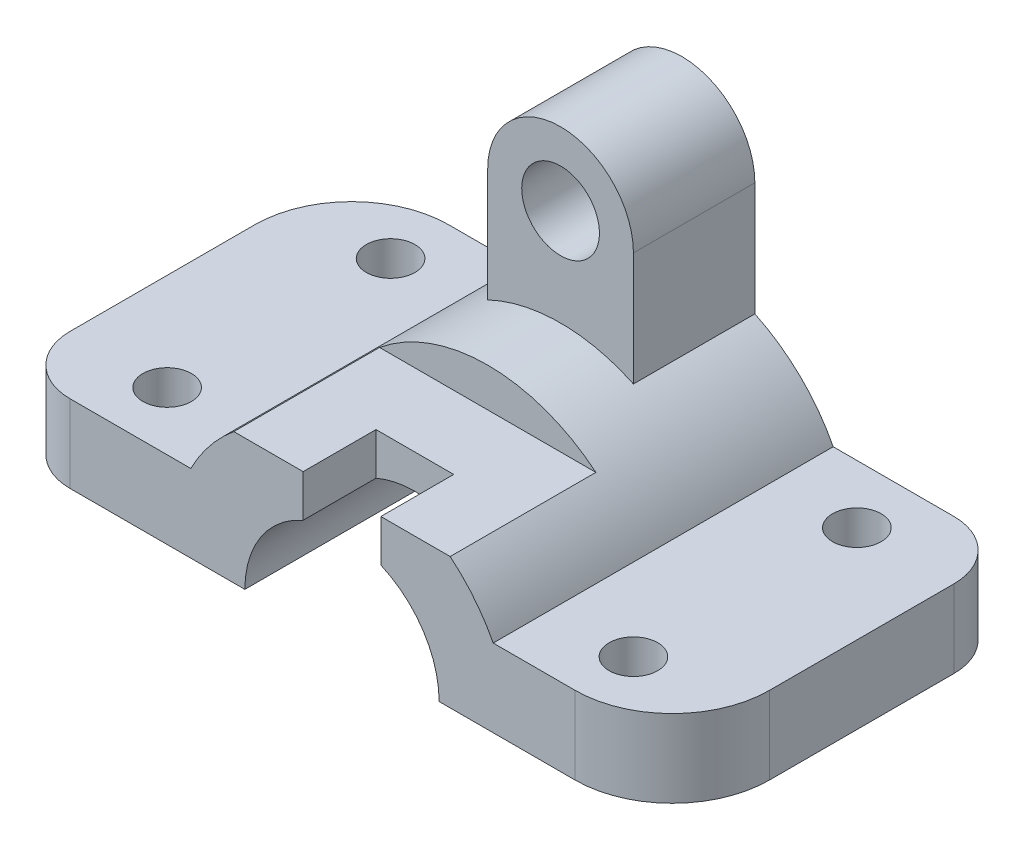
ISO-10303-21;
HEADER;
FILE_DESCRIPTION(('STEP AP214'),'2;1');
FILE_NAME('part.step','',(''),(''),'','','');
FILE_SCHEMA(('AUTOMOTIVE_DESIGN { 1 0 10303 214 1 1 1 1 }'));
ENDSEC;
DATA;
#1=APPLICATION_CONTEXT('core data for automotive mechanical design processes');
#2=APPLICATION_PROTOCOL_DEFINITION('international standard','automotive_design',2000,#1);
#3=PRODUCT_CONTEXT('',#1,'mechanical');
#4=PRODUCT('Part','Part','',(#3));
#5=PRODUCT_RELATED_PRODUCT_CATEGORY('part','',(#4));
#6=PRODUCT_DEFINITION_FORMATION('','',#4);
#7=PRODUCT_DEFINITION_CONTEXT('part definition',#1,'design');
#8=PRODUCT_DEFINITION('design','',#6,#7);
#9=PRODUCT_DEFINITION_SHAPE('','',#8);
#10=(LENGTH_UNIT() NAMED_UNIT(*) SI_UNIT(.MILLI.,.METRE.));
#11=(NAMED_UNIT(*) PLANE_ANGLE_UNIT() SI_UNIT($,.RADIAN.));
#12=(NAMED_UNIT(*) SI_UNIT($,.STERADIAN.) SOLID_ANGLE_UNIT());
#13=UNCERTAINTY_MEASURE_WITH_UNIT(LENGTH_MEASURE(1.E-05),#10,'distance_accuracy_value','');
#14=(GEOMETRIC_REPRESENTATION_CONTEXT(3) GLOBAL_UNCERTAINTY_ASSIGNED_CONTEXT((#13)) GLOBAL_UNIT_ASSIGNED_CONTEXT((#10,
#11,#12)) REPRESENTATION_CONTEXT('',''));
#15=CARTESIAN_POINT('',(0.,0.,0.));
#16=DIRECTION('',(0.,0.,1.));
#17=DIRECTION('',(1.,0.,0.));
#18=AXIS2_PLACEMENT_3D('',#15,#16,#17);
#19=CARTESIAN_POINT('',(0.,0.,0.));
#20=DIRECTION('',(0.,0.,1.));
#21=DIRECTION('',(1.,0.,0.));
#22=AXIS2_PLACEMENT_3D('',#19,#20,#21);
#23=PLANE('',#22);
#24=DIRECTION('',(-1.,0.,0.));
#25=VECTOR('',#24,1.);
#26=CARTESIAN_POINT('',(0.,16.,0.));
#27=LINE('',#26,#25);
#28=CARTESIAN_POINT('',(-31.1287648325468,16.,0.));
#29=VERTEX_POINT('',#28);
#30=CARTESIAN_POINT('',(-56.,16.,0.));
#31=VERTEX_POINT('',#30);
#32=EDGE_CURVE('E341',#29,#31,#27,.T.);
#33=ORIENTED_EDGE('',*,*,#32,.T.);
#34=DIRECTION('',(0.,1.,0.));
#35=VECTOR('',#34,1.);
#36=CARTESIAN_POINT('',(-56.,0.,0.));
#37=LINE('',#36,#35);
#38=CARTESIAN_POINT('',(-56.,0.,0.));
#39=VERTEX_POINT('',#38);
#40=EDGE_CURVE('E56',#31,#39,#37,.F.);
#41=ORIENTED_EDGE('',*,*,#40,.T.);
#42=DIRECTION('',(-1.,0.,0.));
#43=VECTOR('',#42,1.);
#44=CARTESIAN_POINT('',(0.,0.,0.));
#45=LINE('',#44,#43);
#46=CARTESIAN_POINT('',(-20.,0.,0.));
#47=VERTEX_POINT('',#46);
#48=EDGE_CURVE('E344',#47,#39,#45,.T.);
#49=ORIENTED_EDGE('',*,*,#48,.F.);
#50=CARTESIAN_POINT('',(0.,0.,0.));
#51=DIRECTION('',(0.,0.,1.));
#52=DIRECTION('',(1.,0.,0.));
#53=AXIS2_PLACEMENT_3D('',#50,#51,#52);
#54=CIRCLE('',#53,20.);
#55=CARTESIAN_POINT('',(-8.,18.3303027798234,0.));
#56=VERTEX_POINT('',#55);
#57=EDGE_CURVE('E348',#47,#56,#54,.F.);
#58=ORIENTED_EDGE('',*,*,#57,.T.);
#59=DIRECTION('',(0.,1.,0.));
#60=VECTOR('',#59,1.);
#61=CARTESIAN_POINT('',(-8.,0.,0.));
#62=LINE('',#61,#60);
#63=CARTESIAN_POINT('',(-8.,27.,0.));
#64=VERTEX_POINT('',#63);
#65=EDGE_CURVE('E264',#56,#64,#62,.T.);
#66=ORIENTED_EDGE('',*,*,#65,.T.);
#67=DIRECTION('',(1.,0.,0.));
#68=VECTOR('',#67,1.);
#69=CARTESIAN_POINT('',(0.,27.,0.));
#70=LINE('',#69,#68);
#71=CARTESIAN_POINT('',(-22.2710574513201,27.,0.));
#72=VERTEX_POINT('',#71);
#73=EDGE_CURVE('E292',#72,#64,#70,.T.);
#74=ORIENTED_EDGE('',*,*,#73,.F.);
#75=CARTESIAN_POINT('',(0.,0.,0.));
#76=DIRECTION('',(0.,0.,1.));
#77=DIRECTION('',(1.,0.,0.));
#78=AXIS2_PLACEMENT_3D('',#75,#76,#77);
#79=CIRCLE('',#78,35.);
#80=EDGE_CURVE('E337',#29,#72,#79,.F.);
#81=ORIENTED_EDGE('',*,*,#80,.F.);
#82=EDGE_LOOP('',(#33,#41,#49,#58,#66,#74,#81));
#83=FACE_BOUND('',#82,.T.);
#84=ADVANCED_FACE('F47',(#83),#23,.T.);
#85=CARTESIAN_POINT('',(0.,16.,-70.));
#86=DIRECTION('',(0.,-1.,0.));
#87=DIRECTION('',(1.,0.,0.));
#88=AXIS2_PLACEMENT_3D('',#85,#86,#87);
#89=PLANE('',#88);
#90=CARTESIAN_POINT('',(48.,16.,-12.));
#91=DIRECTION('',(0.,1.,0.));
#92=DIRECTION('',(1.,0.,0.));
#93=AXIS2_PLACEMENT_3D('',#90,#91,#92);
#94=CIRCLE('',#93,5.00000000000001);
#95=CARTESIAN_POINT('',(53.,16.,-12.));
#96=VERTEX_POINT('',#95);
#97=EDGE_CURVE('E573',#96,#96,#94,.T.);
#98=ORIENTED_EDGE('',*,*,#97,.F.);
#99=EDGE_LOOP('',(#98));
#100=FACE_BOUND('',#99,.T.);
#101=CARTESIAN_POINT('',(48.,16.,-58.));
#102=DIRECTION('',(0.,1.,0.));
#103=DIRECTION('',(-1.,0.,0.));
#104=AXIS2_PLACEMENT_3D('',#101,#102,#103);
#105=CIRCLE('',#104,5.);
#106=CARTESIAN_POINT('',(43.,16.,-58.));
#107=VERTEX_POINT('',#106);
#108=EDGE_CURVE('E563',#107,#107,#105,.T.);
#109=ORIENTED_EDGE('',*,*,#108,.F.);
#110=EDGE_LOOP('',(#109));
#111=FACE_BOUND('',#110,.T.);
#112=DIRECTION('',(0.,0.,1.));
#113=VECTOR('',#112,1.);
#114=CARTESIAN_POINT('',(68.,16.,-70.));
#115=LINE('',#114,#113);
#116=CARTESIAN_POINT('',(68.,16.,-58.));
#117=VERTEX_POINT('',#116);
#118=CARTESIAN_POINT('',(68.,16.,-20.));
#119=VERTEX_POINT('',#118);
#120=EDGE_CURVE('E355',#117,#119,#115,.T.);
#121=ORIENTED_EDGE('',*,*,#120,.F.);
#122=CARTESIAN_POINT('',(56.,16.,-58.));
#123=DIRECTION('',(0.,-1.,0.));
#124=DIRECTION('',(1.,0.,0.));
#125=AXIS2_PLACEMENT_3D('',#122,#123,#124);
#126=CIRCLE('',#125,12.);
#127=CARTESIAN_POINT('',(56.,16.,-70.));
#128=VERTEX_POINT('',#127);
#129=EDGE_CURVE('E413',#117,#128,#126,.F.);
#130=ORIENTED_EDGE('',*,*,#129,.T.);
#131=DIRECTION('',(1.,0.,0.));
#132=VECTOR('',#131,1.);
#133=CARTESIAN_POINT('',(0.,16.,-70.));
#134=LINE('',#133,#132);
#135=CARTESIAN_POINT('',(31.1287648325468,16.,-70.));
#136=VERTEX_POINT('',#135);
#137=EDGE_CURVE('E307',#136,#128,#134,.T.);
#138=ORIENTED_EDGE('',*,*,#137,.F.);
#139=DIRECTION('',(0.,0.,1.));
#140=VECTOR('',#139,1.);
#141=CARTESIAN_POINT('',(31.1287648325468,16.,-70.));
#142=LINE('',#141,#140);
#143=CARTESIAN_POINT('',(31.1287648325468,16.,0.));
#144=VERTEX_POINT('',#143);
#145=EDGE_CURVE('E332',#136,#144,#142,.T.);
#146=ORIENTED_EDGE('',*,*,#145,.T.);
#147=DIRECTION('',(1.,0.,0.));
#148=VECTOR('',#147,1.);
#149=CARTESIAN_POINT('',(0.,16.,0.));
#150=LINE('',#149,#148);
#151=CARTESIAN_POINT('',(48.,16.,0.));
#152=VERTEX_POINT('',#151);
#153=EDGE_CURVE('E303',#144,#152,#150,.T.);
#154=ORIENTED_EDGE('',*,*,#153,.T.);
#155=CARTESIAN_POINT('',(48.,16.,-20.));
#156=DIRECTION('',(0.,-1.,0.));
#157=DIRECTION('',(1.,0.,0.));
#158=AXIS2_PLACEMENT_3D('',#155,#156,#157);
#159=CIRCLE('',#158,20.);
#160=EDGE_CURVE('E398',#152,#119,#159,.F.);
#161=ORIENTED_EDGE('',*,*,#160,.T.);
#162=EDGE_LOOP('',(#121,#130,#138,#146,#154,#161));
#163=FACE_BOUND('',#162,.T.);
#164=ADVANCED_FACE('F448',(#100,#111,#163),#89,.F.);
#165=CARTESIAN_POINT('',(68.,0.,-70.));
#166=DIRECTION('',(1.,0.,0.));
#167=DIRECTION('',(0.,0.,-1.));
#168=AXIS2_PLACEMENT_3D('',#165,#166,#167);
#169=PLANE('',#168);
#170=DIRECTION('',(0.,0.,1.));
#171=VECTOR('',#170,1.);
#172=CARTESIAN_POINT('',(68.,0.,-70.));
#173=LINE('',#172,#171);
#174=CARTESIAN_POINT('',(68.,0.,-58.));
#175=VERTEX_POINT('',#174);
#176=CARTESIAN_POINT('',(68.,0.,-20.));
#177=VERTEX_POINT('',#176);
#178=EDGE_CURVE('E359',#175,#177,#173,.T.);
#179=ORIENTED_EDGE('',*,*,#178,.F.);
#180=DIRECTION('',(0.,1.,0.));
#181=VECTOR('',#180,1.);
#182=CARTESIAN_POINT('',(68.,16.,-58.));
#183=LINE('',#182,#181);
#184=EDGE_CURVE('E409',#175,#117,#183,.T.);
#185=ORIENTED_EDGE('',*,*,#184,.T.);
#186=ORIENTED_EDGE('',*,*,#120,.T.);
#187=DIRECTION('',(0.,1.,0.));
#188=VECTOR('',#187,1.);
#189=CARTESIAN_POINT('',(68.,0.,-20.));
#190=LINE('',#189,#188);
#191=EDGE_CURVE('E402',#119,#177,#190,.F.);
#192=ORIENTED_EDGE('',*,*,#191,.T.);
#193=EDGE_LOOP('',(#179,#185,#186,#192));
#194=FACE_BOUND('',#193,.T.);
#195=ADVANCED_FACE('F487',(#194),#169,.T.);
#196=CARTESIAN_POINT('',(0.,0.,-70.));
#197=DIRECTION('',(0.,-1.,0.));
#198=DIRECTION('',(1.,0.,0.));
#199=AXIS2_PLACEMENT_3D('',#196,#197,#198);
#200=PLANE('',#199);
#201=CARTESIAN_POINT('',(48.,0.,-12.));
#202=DIRECTION('',(0.,1.,0.));
#203=DIRECTION('',(1.,0.,0.));
#204=AXIS2_PLACEMENT_3D('',#201,#202,#203);
#205=CIRCLE('',#204,5.00000000000001);
#206=CARTESIAN_POINT('',(53.,0.,-12.));
#207=VERTEX_POINT('',#206);
#208=EDGE_CURVE('E577',#207,#207,#205,.T.);
#209=ORIENTED_EDGE('',*,*,#208,.T.);
#210=EDGE_LOOP('',(#209));
#211=FACE_BOUND('',#210,.T.);
#212=CARTESIAN_POINT('',(48.,0.,-58.));
#213=DIRECTION('',(0.,1.,0.));
#214=DIRECTION('',(-1.,0.,0.));
#215=AXIS2_PLACEMENT_3D('',#212,#213,#214);
#216=CIRCLE('',#215,5.);
#217=CARTESIAN_POINT('',(43.,0.,-58.));
#218=VERTEX_POINT('',#217);
#219=EDGE_CURVE('E569',#218,#218,#216,.T.);
#220=ORIENTED_EDGE('',*,*,#219,.T.);
#221=EDGE_LOOP('',(#220));
#222=FACE_BOUND('',#221,.T.);
#223=DIRECTION('',(1.,0.,0.));
#224=VECTOR('',#223,1.);
#225=CARTESIAN_POINT('',(0.,0.,-70.));
#226=LINE('',#225,#224);
#227=CARTESIAN_POINT('',(20.,0.,-70.));
#228=VERTEX_POINT('',#227);
#229=CARTESIAN_POINT('',(56.,0.,-70.));
#230=VERTEX_POINT('',#229);
#231=EDGE_CURVE('E328',#228,#230,#226,.T.);
#232=ORIENTED_EDGE('',*,*,#231,.T.);
#233=CARTESIAN_POINT('',(56.,0.,-58.));
#234=DIRECTION('',(0.,-1.,0.));
#235=DIRECTION('',(1.,0.,0.));
#236=AXIS2_PLACEMENT_3D('',#233,#234,#235);
#237=CIRCLE('',#236,12.);
#238=EDGE_CURVE('E419',#230,#175,#237,.T.);
#239=ORIENTED_EDGE('',*,*,#238,.T.);
#240=ORIENTED_EDGE('',*,*,#178,.T.);
#241=CARTESIAN_POINT('',(48.,0.,-20.));
#242=DIRECTION('',(0.,-1.,0.));
#243=DIRECTION('',(1.,0.,0.));
#244=AXIS2_PLACEMENT_3D('',#241,#242,#243);
#245=CIRCLE('',#244,20.);
#246=CARTESIAN_POINT('',(48.,0.,0.));
#247=VERTEX_POINT('',#246);
#248=EDGE_CURVE('E406',#177,#247,#245,.T.);
#249=ORIENTED_EDGE('',*,*,#248,.T.);
#250=DIRECTION('',(1.,0.,0.));
#251=VECTOR('',#250,1.);
#252=CARTESIAN_POINT('',(0.,0.,0.));
#253=LINE('',#252,#251);
#254=CARTESIAN_POINT('',(20.,0.,0.));
#255=VERTEX_POINT('',#254);
#256=EDGE_CURVE('E312',#255,#247,#253,.T.);
#257=ORIENTED_EDGE('',*,*,#256,.F.);
#258=DIRECTION('',(0.,0.,1.));
#259=VECTOR('',#258,1.);
#260=CARTESIAN_POINT('',(20.,0.,-70.));
#261=LINE('',#260,#259);
#262=EDGE_CURVE('E362',#228,#255,#261,.T.);
#263=ORIENTED_EDGE('',*,*,#262,.F.);
#264=EDGE_LOOP('',(#232,#239,#240,#249,#257,#263));
#265=FACE_BOUND('',#264,.T.);
#266=ADVANCED_FACE('F630',(#211,#222,#265),#200,.T.);
#267=CARTESIAN_POINT('',(0.,0.,-70.));
#268=DIRECTION('',(0.,0.,1.));
#269=DIRECTION('',(1.,0.,0.));
#270=AXIS2_PLACEMENT_3D('',#267,#268,#269);
#271=CYLINDRICAL_SURFACE('',#270,20.);
#272=DIRECTION('',(0.,0.,1.));
#273=VECTOR('',#272,1.);
#274=CARTESIAN_POINT('',(-8.,18.3303027798234,-70.));
#275=LINE('',#274,#273);
#276=CARTESIAN_POINT('',(-8.,18.3303027798234,-15.));
#277=VERTEX_POINT('',#276);
#278=EDGE_CURVE('E283',#56,#277,#275,.F.);
#279=ORIENTED_EDGE('',*,*,#278,.F.);
#280=ORIENTED_EDGE('',*,*,#57,.F.);
#281=DIRECTION('',(0.,0.,1.));
#282=VECTOR('',#281,1.);
#283=CARTESIAN_POINT('',(-20.,0.,-70.));
#284=LINE('',#283,#282);
#285=CARTESIAN_POINT('',(-20.,0.,-70.));
#286=VERTEX_POINT('',#285);
#287=EDGE_CURVE('E366',#286,#47,#284,.T.);
#288=ORIENTED_EDGE('',*,*,#287,.F.);
#289=CARTESIAN_POINT('',(0.,0.,-70.));
#290=DIRECTION('',(0.,0.,1.));
#291=DIRECTION('',(1.,0.,0.));
#292=AXIS2_PLACEMENT_3D('',#289,#290,#291);
#293=CIRCLE('',#292,20.);
#294=EDGE_CURVE('E324',#286,#228,#293,.F.);
#295=ORIENTED_EDGE('',*,*,#294,.T.);
#296=ORIENTED_EDGE('',*,*,#262,.T.);
#297=CARTESIAN_POINT('',(8.,18.3303027798234,0.));
#298=VERTEX_POINT('',#297);
#299=EDGE_CURVE('E347',#298,#255,#54,.F.);
#300=ORIENTED_EDGE('',*,*,#299,.F.);
#301=DIRECTION('',(0.,0.,1.));
#302=VECTOR('',#301,1.);
#303=CARTESIAN_POINT('',(8.,18.3303027798234,-70.));
#304=LINE('',#303,#302);
#305=CARTESIAN_POINT('',(8.,18.3303027798234,-15.));
#306=VERTEX_POINT('',#305);
#307=EDGE_CURVE('E268',#306,#298,#304,.T.);
#308=ORIENTED_EDGE('',*,*,#307,.F.);
#309=CARTESIAN_POINT('',(0.,0.,-15.));
#310=DIRECTION('',(0.,0.,-1.));
#311=DIRECTION('',(-1.,0.,0.));
#312=AXIS2_PLACEMENT_3D('',#309,#310,#311);
#313=CIRCLE('',#312,20.);
#314=EDGE_CURVE('E280',#277,#306,#313,.T.);
#315=ORIENTED_EDGE('',*,*,#314,.F.);
#316=EDGE_LOOP('',(#279,#280,#288,#295,#296,#300,#308,#315));
#317=FACE_BOUND('',#316,.T.);
#318=ADVANCED_FACE('F596',(#317),#271,.F.);
#319=CARTESIAN_POINT('',(0.,0.,-70.));
#320=DIRECTION('',(0.,1.,0.));
#321=DIRECTION('',(-1.,0.,0.));
#322=AXIS2_PLACEMENT_3D('',#319,#320,#321);
#323=PLANE('',#322);
#324=CARTESIAN_POINT('',(-48.,0.,-58.));
#325=DIRECTION('',(0.,1.,0.));
#326=DIRECTION('',(1.,0.,0.));
#327=AXIS2_PLACEMENT_3D('',#324,#325,#326);
#328=CIRCLE('',#327,5.);
#329=CARTESIAN_POINT('',(-43.,0.,-58.));
#330=VERTEX_POINT('',#329);
#331=EDGE_CURVE('E552',#330,#330,#328,.T.);
#332=ORIENTED_EDGE('',*,*,#331,.T.);
#333=EDGE_LOOP('',(#332));
#334=FACE_BOUND('',#333,.T.);
#335=CARTESIAN_POINT('',(-48.,0.,-12.));
#336=DIRECTION('',(0.,1.,0.));
#337=DIRECTION('',(-1.,0.,0.));
#338=AXIS2_PLACEMENT_3D('',#335,#336,#337);
#339=CIRCLE('',#338,5.);
#340=CARTESIAN_POINT('',(-53.,0.,-12.));
#341=VERTEX_POINT('',#340);
#342=EDGE_CURVE('E561',#341,#341,#339,.T.);
#343=ORIENTED_EDGE('',*,*,#342,.T.);
#344=EDGE_LOOP('',(#343));
#345=FACE_BOUND('',#344,.T.);
#346=ORIENTED_EDGE('',*,*,#48,.T.);
#347=CARTESIAN_POINT('',(-56.,0.,-12.));
#348=DIRECTION('',(0.,1.,0.));
#349=DIRECTION('',(-1.,0.,0.));
#350=AXIS2_PLACEMENT_3D('',#347,#348,#349);
#351=CIRCLE('',#350,12.);
#352=CARTESIAN_POINT('',(-68.,0.,-12.));
#353=VERTEX_POINT('',#352);
#354=EDGE_CURVE('E11',#39,#353,#351,.F.);
#355=ORIENTED_EDGE('',*,*,#354,.T.);
#356=DIRECTION('',(0.,0.,1.));
#357=VECTOR('',#356,1.);
#358=CARTESIAN_POINT('',(-68.,0.,-70.));
#359=LINE('',#358,#357);
#360=CARTESIAN_POINT('',(-68.,0.,-50.));
#361=VERTEX_POINT('',#360);
#362=EDGE_CURVE('E369',#361,#353,#359,.T.);
#363=ORIENTED_EDGE('',*,*,#362,.F.);
#364=CARTESIAN_POINT('',(-48.,0.,-50.));
#365=DIRECTION('',(0.,1.,0.));
#366=DIRECTION('',(-1.,0.,0.));
#367=AXIS2_PLACEMENT_3D('',#364,#365,#366);
#368=CIRCLE('',#367,20.);
#369=CARTESIAN_POINT('',(-48.,0.,-70.));
#370=VERTEX_POINT('',#369);
#371=EDGE_CURVE('E391',#361,#370,#368,.F.);
#372=ORIENTED_EDGE('',*,*,#371,.T.);
#373=DIRECTION('',(-1.,0.,0.));
#374=VECTOR('',#373,1.);
#375=CARTESIAN_POINT('',(0.,0.,-70.));
#376=LINE('',#375,#374);
#377=EDGE_CURVE('E320',#286,#370,#376,.T.);
#378=ORIENTED_EDGE('',*,*,#377,.F.);
#379=ORIENTED_EDGE('',*,*,#287,.T.);
#380=EDGE_LOOP('',(#346,#355,#363,#372,#378,#379));
#381=FACE_BOUND('',#380,.T.);
#382=ADVANCED_FACE('F476',(#334,#345,#381),#323,.F.);
#383=CARTESIAN_POINT('',(-68.,0.,-70.));
#384=DIRECTION('',(1.,0.,0.));
#385=DIRECTION('',(0.,0.,-1.));
#386=AXIS2_PLACEMENT_3D('',#383,#384,#385);
#387=PLANE('',#386);
#388=ORIENTED_EDGE('',*,*,#362,.T.);
#389=DIRECTION('',(0.,1.,0.));
#390=VECTOR('',#389,1.);
#391=CARTESIAN_POINT('',(-68.,16.,-12.));
#392=LINE('',#391,#390);
#393=CARTESIAN_POINT('',(-68.,16.,-12.));
#394=VERTEX_POINT('',#393);
#395=EDGE_CURVE('E422',#353,#394,#392,.T.);
#396=ORIENTED_EDGE('',*,*,#395,.T.);
#397=DIRECTION('',(0.,0.,1.));
#398=VECTOR('',#397,1.);
#399=CARTESIAN_POINT('',(-68.,16.,-70.));
#400=LINE('',#399,#398);
#401=CARTESIAN_POINT('',(-68.,16.,-50.));
#402=VERTEX_POINT('',#401);
#403=EDGE_CURVE('E373',#402,#394,#400,.T.);
#404=ORIENTED_EDGE('',*,*,#403,.F.);
#405=DIRECTION('',(0.,1.,0.));
#406=VECTOR('',#405,1.);
#407=CARTESIAN_POINT('',(-68.,0.,-50.));
#408=LINE('',#407,#406);
#409=EDGE_CURVE('E388',#402,#361,#408,.F.);
#410=ORIENTED_EDGE('',*,*,#409,.T.);
#411=EDGE_LOOP('',(#388,#396,#404,#410));
#412=FACE_BOUND('',#411,.T.);
#413=ADVANCED_FACE('F467',(#412),#387,.F.);
#414=CARTESIAN_POINT('',(0.,16.,-70.));
#415=DIRECTION('',(0.,1.,0.));
#416=DIRECTION('',(-1.,0.,0.));
#417=AXIS2_PLACEMENT_3D('',#414,#415,#416);
#418=PLANE('',#417);
#419=CARTESIAN_POINT('',(-48.,16.,-58.));
#420=DIRECTION('',(0.,1.,0.));
#421=DIRECTION('',(1.,0.,0.));
#422=AXIS2_PLACEMENT_3D('',#419,#420,#421);
#423=CIRCLE('',#422,5.);
#424=CARTESIAN_POINT('',(-43.,16.,-58.));
#425=VERTEX_POINT('',#424);
#426=EDGE_CURVE('E554',#425,#425,#423,.T.);
#427=ORIENTED_EDGE('',*,*,#426,.F.);
#428=EDGE_LOOP('',(#427));
#429=FACE_BOUND('',#428,.T.);
#430=CARTESIAN_POINT('',(-48.,16.,-12.));
#431=DIRECTION('',(0.,1.,0.));
#432=DIRECTION('',(-1.,0.,0.));
#433=AXIS2_PLACEMENT_3D('',#430,#431,#432);
#434=CIRCLE('',#433,5.);
#435=CARTESIAN_POINT('',(-53.,16.,-12.));
#436=VERTEX_POINT('',#435);
#437=EDGE_CURVE('E556',#436,#436,#434,.T.);
#438=ORIENTED_EDGE('',*,*,#437,.F.);
#439=EDGE_LOOP('',(#438));
#440=FACE_BOUND('',#439,.T.);
#441=ORIENTED_EDGE('',*,*,#403,.T.);
#442=CARTESIAN_POINT('',(-56.,16.,-12.));
#443=DIRECTION('',(0.,1.,0.));
#444=DIRECTION('',(-1.,0.,0.));
#445=AXIS2_PLACEMENT_3D('',#442,#443,#444);
#446=CIRCLE('',#445,12.);
#447=EDGE_CURVE('E70',#394,#31,#446,.T.);
#448=ORIENTED_EDGE('',*,*,#447,.T.);
#449=ORIENTED_EDGE('',*,*,#32,.F.);
#450=DIRECTION('',(0.,0.,1.));
#451=VECTOR('',#450,1.);
#452=CARTESIAN_POINT('',(-31.1287648325468,16.,-70.));
#453=LINE('',#452,#451);
#454=CARTESIAN_POINT('',(-31.1287648325468,16.,-70.));
#455=VERTEX_POINT('',#454);
#456=EDGE_CURVE('E376',#455,#29,#453,.T.);
#457=ORIENTED_EDGE('',*,*,#456,.F.);
#458=DIRECTION('',(-1.,0.,0.));
#459=VECTOR('',#458,1.);
#460=CARTESIAN_POINT('',(0.,16.,-70.));
#461=LINE('',#460,#459);
#462=CARTESIAN_POINT('',(-48.,16.,-70.));
#463=VERTEX_POINT('',#462);
#464=EDGE_CURVE('E316',#455,#463,#461,.T.);
#465=ORIENTED_EDGE('',*,*,#464,.T.);
#466=CARTESIAN_POINT('',(-48.,16.,-50.));
#467=DIRECTION('',(0.,1.,0.));
#468=DIRECTION('',(-1.,0.,0.));
#469=AXIS2_PLACEMENT_3D('',#466,#467,#468);
#470=CIRCLE('',#469,20.);
#471=EDGE_CURVE('E385',#463,#402,#470,.T.);
#472=ORIENTED_EDGE('',*,*,#471,.T.);
#473=EDGE_LOOP('',(#441,#448,#449,#457,#465,#472));
#474=FACE_BOUND('',#473,.T.);
#475=ADVANCED_FACE('F464',(#429,#440,#474),#418,.T.);
#476=CARTESIAN_POINT('',(0.,0.,-70.));
#477=DIRECTION('',(0.,0.,1.));
#478=DIRECTION('',(1.,0.,0.));
#479=AXIS2_PLACEMENT_3D('',#476,#477,#478);
#480=CYLINDRICAL_SURFACE('',#479,35.);
#481=CARTESIAN_POINT('',(0.,0.,-70.));
#482=DIRECTION('',(0.,0.,1.));
#483=DIRECTION('',(1.,0.,0.));
#484=AXIS2_PLACEMENT_3D('',#481,#482,#483);
#485=CIRCLE('',#484,35.);
#486=CARTESIAN_POINT('',(15.,31.6227766016838,-70.));
#487=VERTEX_POINT('',#486);
#488=EDGE_CURVE('E311',#487,#136,#485,.F.);
#489=ORIENTED_EDGE('',*,*,#488,.F.);
#490=DIRECTION('',(0.,0.,-1.));
#491=VECTOR('',#490,1.);
#492=CARTESIAN_POINT('',(15.,31.6227766016838,-45.));
#493=LINE('',#492,#491);
#494=CARTESIAN_POINT('',(15.,31.6227766016838,-45.));
#495=VERTEX_POINT('',#494);
#496=EDGE_CURVE('E225',#495,#487,#493,.T.);
#497=ORIENTED_EDGE('',*,*,#496,.F.);
#498=CARTESIAN_POINT('',(0.,0.,-45.));
#499=DIRECTION('',(0.,0.,1.));
#500=DIRECTION('',(-1.,0.,0.));
#501=AXIS2_PLACEMENT_3D('',#498,#499,#500);
#502=CIRCLE('',#501,35.);
#503=CARTESIAN_POINT('',(-15.,31.6227766016838,-45.));
#504=VERTEX_POINT('',#503);
#505=EDGE_CURVE('E215',#495,#504,#502,.T.);
#506=ORIENTED_EDGE('',*,*,#505,.T.);
#507=DIRECTION('',(0.,0.,-1.));
#508=VECTOR('',#507,1.);
#509=CARTESIAN_POINT('',(-15.,31.6227766016838,-45.));
#510=LINE('',#509,#508);
#511=CARTESIAN_POINT('',(-15.,31.6227766016838,-70.));
#512=VERTEX_POINT('',#511);
#513=EDGE_CURVE('E197',#504,#512,#510,.T.);
#514=ORIENTED_EDGE('',*,*,#513,.T.);
#515=EDGE_CURVE('E313',#455,#512,#485,.F.);
#516=ORIENTED_EDGE('',*,*,#515,.F.);
#517=ORIENTED_EDGE('',*,*,#456,.T.);
#518=ORIENTED_EDGE('',*,*,#80,.T.);
#519=DIRECTION('',(0.,0.,1.));
#520=VECTOR('',#519,1.);
#521=CARTESIAN_POINT('',(-22.2710574513201,27.,-30.));
#522=LINE('',#521,#520);
#523=CARTESIAN_POINT('',(-22.2710574513201,27.,-30.));
#524=VERTEX_POINT('',#523);
#525=EDGE_CURVE('E300',#524,#72,#522,.T.);
#526=ORIENTED_EDGE('',*,*,#525,.F.);
#527=CARTESIAN_POINT('',(0.,0.,-30.));
#528=DIRECTION('',(0.,0.,1.));
#529=DIRECTION('',(1.,0.,0.));
#530=AXIS2_PLACEMENT_3D('',#527,#528,#529);
#531=CIRCLE('',#530,35.);
#532=CARTESIAN_POINT('',(22.2710574513201,27.,-30.));
#533=VERTEX_POINT('',#532);
#534=EDGE_CURVE('E291',#524,#533,#531,.F.);
#535=ORIENTED_EDGE('',*,*,#534,.T.);
#536=DIRECTION('',(0.,0.,1.));
#537=VECTOR('',#536,1.);
#538=CARTESIAN_POINT('',(22.2710574513201,27.,-30.));
#539=LINE('',#538,#537);
#540=CARTESIAN_POINT('',(22.2710574513201,27.,0.));
#541=VERTEX_POINT('',#540);
#542=EDGE_CURVE('E296',#533,#541,#539,.T.);
#543=ORIENTED_EDGE('',*,*,#542,.T.);
#544=EDGE_CURVE('E336',#541,#144,#79,.F.);
#545=ORIENTED_EDGE('',*,*,#544,.T.);
#546=ORIENTED_EDGE('',*,*,#145,.F.);
#547=EDGE_LOOP('',(#489,#497,#506,#514,#516,#517,#518,#526,#535,#543,#545,#546));
#548=FACE_BOUND('',#547,.T.);
#549=ADVANCED_FACE('F223',(#548),#480,.T.);
#550=CARTESIAN_POINT('',(0.,0.,-70.));
#551=DIRECTION('',(0.,0.,1.));
#552=DIRECTION('',(1.,0.,0.));
#553=AXIS2_PLACEMENT_3D('',#550,#551,#552);
#554=PLANE('',#553);
#555=ORIENTED_EDGE('',*,*,#137,.T.);
#556=DIRECTION('',(0.,1.,0.));
#557=VECTOR('',#556,1.);
#558=CARTESIAN_POINT('',(56.,0.,-70.));
#559=LINE('',#558,#557);
#560=EDGE_CURVE('E416',#128,#230,#559,.F.);
#561=ORIENTED_EDGE('',*,*,#560,.T.);
#562=ORIENTED_EDGE('',*,*,#231,.F.);
#563=ORIENTED_EDGE('',*,*,#294,.F.);
#564=ORIENTED_EDGE('',*,*,#377,.T.);
#565=DIRECTION('',(0.,1.,0.));
#566=VECTOR('',#565,1.);
#567=CARTESIAN_POINT('',(-48.,0.,-70.));
#568=LINE('',#567,#566);
#569=EDGE_CURVE('E358',#370,#463,#568,.T.);
#570=ORIENTED_EDGE('',*,*,#569,.T.);
#571=ORIENTED_EDGE('',*,*,#464,.F.);
#572=ORIENTED_EDGE('',*,*,#515,.T.);
#573=DIRECTION('',(0.,1.,0.));
#574=VECTOR('',#573,1.);
#575=CARTESIAN_POINT('',(-15.,31.6227766016838,-70.));
#576=LINE('',#575,#574);
#577=CARTESIAN_POINT('',(-15.,55.,-70.));
#578=VERTEX_POINT('',#577);
#579=EDGE_CURVE('E202',#512,#578,#576,.T.);
#580=ORIENTED_EDGE('',*,*,#579,.T.);
#581=CARTESIAN_POINT('',(0.,55.,-70.));
#582=DIRECTION('',(0.,0.,-1.));
#583=DIRECTION('',(-1.,0.,0.));
#584=AXIS2_PLACEMENT_3D('',#581,#582,#583);
#585=CIRCLE('',#584,15.);
#586=CARTESIAN_POINT('',(15.,55.,-70.));
#587=VERTEX_POINT('',#586);
#588=EDGE_CURVE('E230',#578,#587,#585,.T.);
#589=ORIENTED_EDGE('',*,*,#588,.T.);
#590=DIRECTION('',(0.,-1.,0.));
#591=VECTOR('',#590,1.);
#592=CARTESIAN_POINT('',(15.,31.6227766016838,-70.));
#593=LINE('',#592,#591);
#594=EDGE_CURVE('E227',#587,#487,#593,.T.);
#595=ORIENTED_EDGE('',*,*,#594,.T.);
#596=ORIENTED_EDGE('',*,*,#488,.T.);
#597=EDGE_LOOP('',(#555,#561,#562,#563,#564,#570,#571,#572,#580,#589,#595,#596));
#598=FACE_BOUND('',#597,.T.);
#599=CARTESIAN_POINT('',(0.,55.,-70.));
#600=DIRECTION('',(0.,0.,-1.));
#601=DIRECTION('',(-1.,0.,0.));
#602=AXIS2_PLACEMENT_3D('',#599,#600,#601);
#603=CIRCLE('',#602,8.);
#604=CARTESIAN_POINT('',(-8.,55.,-70.));
#605=VERTEX_POINT('',#604);
#606=EDGE_CURVE('E233',#605,#605,#603,.T.);
#607=ORIENTED_EDGE('',*,*,#606,.F.);
#608=EDGE_LOOP('',(#607));
#609=FACE_BOUND('',#608,.T.);
#610=ADVANCED_FACE('F452',(#598,#609),#554,.F.);
#611=ORIENTED_EDGE('',*,*,#256,.T.);
#612=DIRECTION('',(0.,1.,0.));
#613=VECTOR('',#612,1.);
#614=CARTESIAN_POINT('',(48.,0.,0.));
#615=LINE('',#614,#613);
#616=EDGE_CURVE('E394',#247,#152,#615,.T.);
#617=ORIENTED_EDGE('',*,*,#616,.T.);
#618=ORIENTED_EDGE('',*,*,#153,.F.);
#619=ORIENTED_EDGE('',*,*,#544,.F.);
#620=CARTESIAN_POINT('',(8.,27.,0.));
#621=VERTEX_POINT('',#620);
#622=EDGE_CURVE('E286',#621,#541,#70,.T.);
#623=ORIENTED_EDGE('',*,*,#622,.F.);
#624=DIRECTION('',(0.,1.,0.));
#625=VECTOR('',#624,1.);
#626=CARTESIAN_POINT('',(8.,0.,0.));
#627=LINE('',#626,#625);
#628=EDGE_CURVE('E272',#298,#621,#627,.T.);
#629=ORIENTED_EDGE('',*,*,#628,.F.);
#630=ORIENTED_EDGE('',*,*,#299,.T.);
#631=EDGE_LOOP('',(#611,#617,#618,#619,#623,#629,#630));
#632=FACE_BOUND('',#631,.T.);
#633=ADVANCED_FACE('F444',(#632),#23,.T.);
#634=CARTESIAN_POINT('',(0.,27.,-30.));
#635=DIRECTION('',(0.,-1.,0.));
#636=DIRECTION('',(0.,0.,-1.));
#637=AXIS2_PLACEMENT_3D('',#634,#635,#636);
#638=PLANE('',#637);
#639=ORIENTED_EDGE('',*,*,#73,.T.);
#640=DIRECTION('',(0.,0.,1.));
#641=VECTOR('',#640,1.);
#642=CARTESIAN_POINT('',(-8.,27.,0.));
#643=LINE('',#642,#641);
#644=CARTESIAN_POINT('',(-8.,27.,-15.));
#645=VERTEX_POINT('',#644);
#646=EDGE_CURVE('E248',#645,#64,#643,.T.);
#647=ORIENTED_EDGE('',*,*,#646,.F.);
#648=DIRECTION('',(-1.,0.,0.));
#649=VECTOR('',#648,1.);
#650=CARTESIAN_POINT('',(-8.,27.,-15.));
#651=LINE('',#650,#649);
#652=CARTESIAN_POINT('',(8.,27.,-15.));
#653=VERTEX_POINT('',#652);
#654=EDGE_CURVE('E260',#653,#645,#651,.T.);
#655=ORIENTED_EDGE('',*,*,#654,.F.);
#656=DIRECTION('',(0.,0.,-1.));
#657=VECTOR('',#656,1.);
#658=CARTESIAN_POINT('',(8.,27.,0.));
#659=LINE('',#658,#657);
#660=EDGE_CURVE('E256',#621,#653,#659,.T.);
#661=ORIENTED_EDGE('',*,*,#660,.F.);
#662=ORIENTED_EDGE('',*,*,#622,.T.);
#663=ORIENTED_EDGE('',*,*,#542,.F.);
#664=DIRECTION('',(1.,0.,0.));
#665=VECTOR('',#664,1.);
#666=CARTESIAN_POINT('',(0.,27.,-30.));
#667=LINE('',#666,#665);
#668=EDGE_CURVE('E287',#524,#533,#667,.T.);
#669=ORIENTED_EDGE('',*,*,#668,.F.);
#670=ORIENTED_EDGE('',*,*,#525,.T.);
#671=EDGE_LOOP('',(#639,#647,#655,#661,#662,#663,#669,#670));
#672=FACE_BOUND('',#671,.T.);
#673=ADVANCED_FACE('F435',(#672),#638,.F.);
#674=CARTESIAN_POINT('',(0.,0.,-30.));
#675=DIRECTION('',(0.,0.,1.));
#676=DIRECTION('',(1.,0.,0.));
#677=AXIS2_PLACEMENT_3D('',#674,#675,#676);
#678=PLANE('',#677);
#679=ORIENTED_EDGE('',*,*,#668,.T.);
#680=ORIENTED_EDGE('',*,*,#534,.F.);
#681=EDGE_LOOP('',(#679,#680));
#682=FACE_BOUND('',#681,.T.);
#683=ADVANCED_FACE('F498',(#682),#678,.T.);
#684=CARTESIAN_POINT('',(-8.,0.,0.));
#685=DIRECTION('',(-1.,0.,0.));
#686=DIRECTION('',(0.,0.,1.));
#687=AXIS2_PLACEMENT_3D('',#684,#685,#686);
#688=PLANE('',#687);
#689=ORIENTED_EDGE('',*,*,#278,.T.);
#690=DIRECTION('',(0.,1.,0.));
#691=VECTOR('',#690,1.);
#692=CARTESIAN_POINT('',(-8.,0.,-15.));
#693=LINE('',#692,#691);
#694=EDGE_CURVE('E265',#277,#645,#693,.T.);
#695=ORIENTED_EDGE('',*,*,#694,.T.);
#696=ORIENTED_EDGE('',*,*,#646,.T.);
#697=ORIENTED_EDGE('',*,*,#65,.F.);
#698=EDGE_LOOP('',(#689,#695,#696,#697));
#699=FACE_BOUND('',#698,.T.);
#700=ADVANCED_FACE('F506',(#699),#688,.F.);
#701=CARTESIAN_POINT('',(-8.,0.,-15.));
#702=DIRECTION('',(0.,0.,-1.));
#703=DIRECTION('',(-1.,0.,0.));
#704=AXIS2_PLACEMENT_3D('',#701,#702,#703);
#705=PLANE('',#704);
#706=ORIENTED_EDGE('',*,*,#314,.T.);
#707=DIRECTION('',(0.,1.,0.));
#708=VECTOR('',#707,1.);
#709=CARTESIAN_POINT('',(8.,0.,-15.));
#710=LINE('',#709,#708);
#711=EDGE_CURVE('E269',#306,#653,#710,.T.);
#712=ORIENTED_EDGE('',*,*,#711,.T.);
#713=ORIENTED_EDGE('',*,*,#654,.T.);
#714=ORIENTED_EDGE('',*,*,#694,.F.);
#715=EDGE_LOOP('',(#706,#712,#713,#714));
#716=FACE_BOUND('',#715,.T.);
#717=ADVANCED_FACE('F510',(#716),#705,.F.);
#718=CARTESIAN_POINT('',(8.,0.,0.));
#719=DIRECTION('',(1.,0.,0.));
#720=DIRECTION('',(0.,0.,-1.));
#721=AXIS2_PLACEMENT_3D('',#718,#719,#720);
#722=PLANE('',#721);
#723=ORIENTED_EDGE('',*,*,#307,.T.);
#724=ORIENTED_EDGE('',*,*,#628,.T.);
#725=ORIENTED_EDGE('',*,*,#660,.T.);
#726=ORIENTED_EDGE('',*,*,#711,.F.);
#727=EDGE_LOOP('',(#723,#724,#725,#726));
#728=FACE_BOUND('',#727,.T.);
#729=ADVANCED_FACE('F512',(#728),#722,.F.);
#730=CARTESIAN_POINT('',(15.,31.6227766016838,-45.));
#731=DIRECTION('',(1.,0.,0.));
#732=DIRECTION('',(0.,0.,-1.));
#733=AXIS2_PLACEMENT_3D('',#730,#731,#732);
#734=PLANE('',#733);
#735=ORIENTED_EDGE('',*,*,#594,.F.);
#736=DIRECTION('',(0.,0.,-1.));
#737=VECTOR('',#736,1.);
#738=CARTESIAN_POINT('',(15.,55.,-45.));
#739=LINE('',#738,#737);
#740=CARTESIAN_POINT('',(15.,55.,-45.));
#741=VERTEX_POINT('',#740);
#742=EDGE_CURVE('E249',#741,#587,#739,.T.);
#743=ORIENTED_EDGE('',*,*,#742,.F.);
#744=DIRECTION('',(0.,-1.,0.));
#745=VECTOR('',#744,1.);
#746=CARTESIAN_POINT('',(15.,31.6227766016838,-45.));
#747=LINE('',#746,#745);
#748=EDGE_CURVE('E209',#741,#495,#747,.T.);
#749=ORIENTED_EDGE('',*,*,#748,.T.);
#750=ORIENTED_EDGE('',*,*,#496,.T.);
#751=EDGE_LOOP('',(#735,#743,#749,#750));
#752=FACE_BOUND('',#751,.T.);
#753=ADVANCED_FACE('F458',(#752),#734,.T.);
#754=CARTESIAN_POINT('',(0.,55.,-45.));
#755=DIRECTION('',(0.,0.,-1.));
#756=DIRECTION('',(-1.,0.,0.));
#757=AXIS2_PLACEMENT_3D('',#754,#755,#756);
#758=CYLINDRICAL_SURFACE('',#757,15.);
#759=ORIENTED_EDGE('',*,*,#588,.F.);
#760=DIRECTION('',(0.,0.,-1.));
#761=VECTOR('',#760,1.);
#762=CARTESIAN_POINT('',(-15.,55.,-45.));
#763=LINE('',#762,#761);
#764=CARTESIAN_POINT('',(-15.,55.,-45.));
#765=VERTEX_POINT('',#764);
#766=EDGE_CURVE('E208',#765,#578,#763,.T.);
#767=ORIENTED_EDGE('',*,*,#766,.F.);
#768=CARTESIAN_POINT('',(0.,55.,-45.));
#769=DIRECTION('',(0.,0.,-1.));
#770=DIRECTION('',(-1.,0.,0.));
#771=AXIS2_PLACEMENT_3D('',#768,#769,#770);
#772=CIRCLE('',#771,15.);
#773=EDGE_CURVE('E218',#765,#741,#772,.T.);
#774=ORIENTED_EDGE('',*,*,#773,.T.);
#775=ORIENTED_EDGE('',*,*,#742,.T.);
#776=EDGE_LOOP('',(#759,#767,#774,#775));
#777=FACE_BOUND('',#776,.T.);
#778=ADVANCED_FACE('F460',(#777),#758,.T.);
#779=CARTESIAN_POINT('',(-15.,31.6227766016838,-45.));
#780=DIRECTION('',(-1.,0.,0.));
#781=DIRECTION('',(0.,0.,1.));
#782=AXIS2_PLACEMENT_3D('',#779,#780,#781);
#783=PLANE('',#782);
#784=ORIENTED_EDGE('',*,*,#579,.F.);
#785=ORIENTED_EDGE('',*,*,#513,.F.);
#786=DIRECTION('',(0.,1.,0.));
#787=VECTOR('',#786,1.);
#788=CARTESIAN_POINT('',(-15.,31.6227766016838,-45.));
#789=LINE('',#788,#787);
#790=EDGE_CURVE('E200',#504,#765,#789,.T.);
#791=ORIENTED_EDGE('',*,*,#790,.T.);
#792=ORIENTED_EDGE('',*,*,#766,.T.);
#793=EDGE_LOOP('',(#784,#785,#791,#792));
#794=FACE_BOUND('',#793,.T.);
#795=ADVANCED_FACE('F199',(#794),#783,.T.);
#796=CARTESIAN_POINT('',(0.,0.,-45.));
#797=DIRECTION('',(0.,0.,-1.));
#798=DIRECTION('',(-1.,0.,0.));
#799=AXIS2_PLACEMENT_3D('',#796,#797,#798);
#800=PLANE('',#799);
#801=CARTESIAN_POINT('',(0.,55.,-45.));
#802=DIRECTION('',(0.,0.,-1.));
#803=DIRECTION('',(-1.,0.,0.));
#804=AXIS2_PLACEMENT_3D('',#801,#802,#803);
#805=CIRCLE('',#804,8.);
#806=CARTESIAN_POINT('',(-8.,55.,-45.));
#807=VERTEX_POINT('',#806);
#808=EDGE_CURVE('E242',#807,#807,#805,.T.);
#809=ORIENTED_EDGE('',*,*,#808,.T.);
#810=EDGE_LOOP('',(#809));
#811=FACE_BOUND('',#810,.T.);
#812=ORIENTED_EDGE('',*,*,#505,.F.);
#813=ORIENTED_EDGE('',*,*,#748,.F.);
#814=ORIENTED_EDGE('',*,*,#773,.F.);
#815=ORIENTED_EDGE('',*,*,#790,.F.);
#816=EDGE_LOOP('',(#812,#813,#814,#815));
#817=FACE_BOUND('',#816,.T.);
#818=ADVANCED_FACE('F213',(#811,#817),#800,.F.);
#819=CARTESIAN_POINT('',(0.,55.,-45.));
#820=DIRECTION('',(0.,0.,-1.));
#821=DIRECTION('',(-1.,0.,0.));
#822=AXIS2_PLACEMENT_3D('',#819,#820,#821);
#823=CYLINDRICAL_SURFACE('',#822,8.);
#824=ORIENTED_EDGE('',*,*,#808,.F.);
#825=EDGE_LOOP('',(#824));
#826=FACE_BOUND('',#825,.T.);
#827=ORIENTED_EDGE('',*,*,#606,.T.);
#828=EDGE_LOOP('',(#827));
#829=FACE_BOUND('',#828,.T.);
#830=ADVANCED_FACE('F527',(#826,#829),#823,.F.);
#831=CARTESIAN_POINT('',(-48.,0.,-12.));
#832=DIRECTION('',(0.,1.,0.));
#833=DIRECTION('',(-1.,0.,0.));
#834=AXIS2_PLACEMENT_3D('',#831,#832,#833);
#835=CYLINDRICAL_SURFACE('',#834,5.);
#836=ORIENTED_EDGE('',*,*,#342,.F.);
#837=EDGE_LOOP('',(#836));
#838=FACE_BOUND('',#837,.T.);
#839=ORIENTED_EDGE('',*,*,#437,.T.);
#840=EDGE_LOOP('',(#839));
#841=FACE_BOUND('',#840,.T.);
#842=ADVANCED_FACE('F531',(#838,#841),#835,.F.);
#843=CARTESIAN_POINT('',(-48.,0.,-58.));
#844=DIRECTION('',(0.,1.,0.));
#845=DIRECTION('',(-1.,0.,0.));
#846=AXIS2_PLACEMENT_3D('',#843,#844,#845);
#847=CYLINDRICAL_SURFACE('',#846,5.);
#848=ORIENTED_EDGE('',*,*,#331,.F.);
#849=EDGE_LOOP('',(#848));
#850=FACE_BOUND('',#849,.T.);
#851=ORIENTED_EDGE('',*,*,#426,.T.);
#852=EDGE_LOOP('',(#851));
#853=FACE_BOUND('',#852,.T.);
#854=ADVANCED_FACE('F535',(#850,#853),#847,.F.);
#855=CARTESIAN_POINT('',(48.,0.,-58.));
#856=DIRECTION('',(0.,1.,0.));
#857=DIRECTION('',(-1.,0.,0.));
#858=AXIS2_PLACEMENT_3D('',#855,#856,#857);
#859=CYLINDRICAL_SURFACE('',#858,5.);
#860=ORIENTED_EDGE('',*,*,#219,.F.);
#861=EDGE_LOOP('',(#860));
#862=FACE_BOUND('',#861,.T.);
#863=ORIENTED_EDGE('',*,*,#108,.T.);
#864=EDGE_LOOP('',(#863));
#865=FACE_BOUND('',#864,.T.);
#866=ADVANCED_FACE('F540',(#862,#865),#859,.F.);
#867=CARTESIAN_POINT('',(48.,0.,-12.));
#868=DIRECTION('',(0.,1.,0.));
#869=DIRECTION('',(-1.,0.,0.));
#870=AXIS2_PLACEMENT_3D('',#867,#868,#869);
#871=CYLINDRICAL_SURFACE('',#870,5.00000000000001);
#872=ORIENTED_EDGE('',*,*,#208,.F.);
#873=EDGE_LOOP('',(#872));
#874=FACE_BOUND('',#873,.T.);
#875=ORIENTED_EDGE('',*,*,#97,.T.);
#876=EDGE_LOOP('',(#875));
#877=FACE_BOUND('',#876,.T.);
#878=ADVANCED_FACE('F537',(#874,#877),#871,.F.);
#879=CARTESIAN_POINT('',(-48.,0.,-50.));
#880=DIRECTION('',(0.,1.,0.));
#881=DIRECTION('',(0.,0.,1.));
#882=AXIS2_PLACEMENT_3D('',#879,#880,#881);
#883=CYLINDRICAL_SURFACE('',#882,20.);
#884=ORIENTED_EDGE('',*,*,#371,.F.);
#885=ORIENTED_EDGE('',*,*,#409,.F.);
#886=ORIENTED_EDGE('',*,*,#471,.F.);
#887=ORIENTED_EDGE('',*,*,#569,.F.);
#888=EDGE_LOOP('',(#884,#885,#886,#887));
#889=FACE_BOUND('',#888,.T.);
#890=ADVANCED_FACE('F539',(#889),#883,.T.);
#891=CARTESIAN_POINT('',(48.,0.,-20.));
#892=DIRECTION('',(0.,1.,0.));
#893=DIRECTION('',(0.,0.,1.));
#894=AXIS2_PLACEMENT_3D('',#891,#892,#893);
#895=CYLINDRICAL_SURFACE('',#894,20.);
#896=ORIENTED_EDGE('',*,*,#248,.F.);
#897=ORIENTED_EDGE('',*,*,#191,.F.);
#898=ORIENTED_EDGE('',*,*,#160,.F.);
#899=ORIENTED_EDGE('',*,*,#616,.F.);
#900=EDGE_LOOP('',(#896,#897,#898,#899));
#901=FACE_BOUND('',#900,.T.);
#902=ADVANCED_FACE('F623',(#901),#895,.T.);
#903=CARTESIAN_POINT('',(56.,0.,-58.));
#904=DIRECTION('',(0.,-1.,0.));
#905=DIRECTION('',(0.,0.,-1.));
#906=AXIS2_PLACEMENT_3D('',#903,#904,#905);
#907=CYLINDRICAL_SURFACE('',#906,12.);
#908=ORIENTED_EDGE('',*,*,#238,.F.);
#909=ORIENTED_EDGE('',*,*,#560,.F.);
#910=ORIENTED_EDGE('',*,*,#129,.F.);
#911=ORIENTED_EDGE('',*,*,#184,.F.);
#912=EDGE_LOOP('',(#908,#909,#910,#911));
#913=FACE_BOUND('',#912,.T.);
#914=ADVANCED_FACE('F629',(#913),#907,.T.);
#915=CARTESIAN_POINT('',(-56.,0.,-12.));
#916=DIRECTION('',(0.,-1.,0.));
#917=DIRECTION('',(0.,0.,-1.));
#918=AXIS2_PLACEMENT_3D('',#915,#916,#917);
#919=CYLINDRICAL_SURFACE('',#918,12.);
#920=ORIENTED_EDGE('',*,*,#354,.F.);
#921=ORIENTED_EDGE('',*,*,#40,.F.);
#922=ORIENTED_EDGE('',*,*,#447,.F.);
#923=ORIENTED_EDGE('',*,*,#395,.F.);
#924=EDGE_LOOP('',(#920,#921,#922,#923));
#925=FACE_BOUND('',#924,.T.);
#926=ADVANCED_FACE('F49',(#925),#919,.T.);
#927=CLOSED_SHELL('',(#84,#164,#195,#266,#318,#382,#413,#475,#549,#610,#633,#673,#683,#700,#717,
#729,#753,#778,#795,#818,#830,#842,#854,#866,#878,#890,#902,#914,#926));
#928=MANIFOLD_SOLID_BREP('B2',#927);
#929=ADVANCED_BREP_SHAPE_REPRESENTATION('',(#18,#928),#14);
#930=SHAPE_DEFINITION_REPRESENTATION(#9,#929);
ENDSEC;
END-ISO-10303-21;
